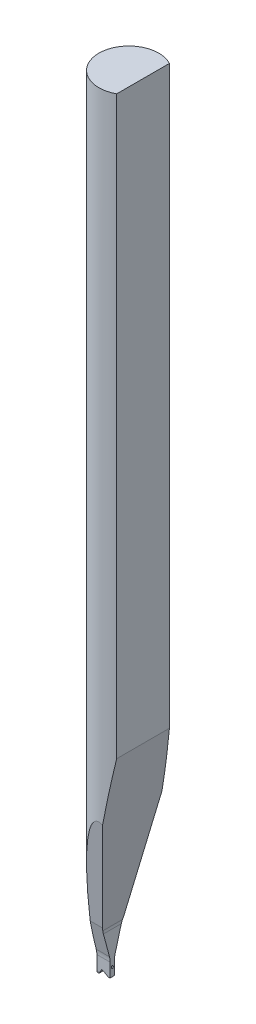
ISO-10303-21;
HEADER;
FILE_DESCRIPTION(('STEP AP214'),'2;1');
FILE_NAME('part.step','',(''),(''),'','','');
FILE_SCHEMA(('AUTOMOTIVE_DESIGN { 1 0 10303 214 1 1 1 1 }'));
ENDSEC;
DATA;
#1=APPLICATION_CONTEXT('core data for automotive mechanical design processes');
#2=APPLICATION_PROTOCOL_DEFINITION('international standard','automotive_design',2000,#1);
#3=PRODUCT_CONTEXT('',#1,'mechanical');
#4=PRODUCT('Part','Part','',(#3));
#5=PRODUCT_RELATED_PRODUCT_CATEGORY('part','',(#4));
#6=PRODUCT_DEFINITION_FORMATION('','',#4);
#7=PRODUCT_DEFINITION_CONTEXT('part definition',#1,'design');
#8=PRODUCT_DEFINITION('design','',#6,#7);
#9=PRODUCT_DEFINITION_SHAPE('','',#8);
#10=(LENGTH_UNIT() NAMED_UNIT(*) SI_UNIT(.MILLI.,.METRE.));
#11=(NAMED_UNIT(*) PLANE_ANGLE_UNIT() SI_UNIT($,.RADIAN.));
#12=(NAMED_UNIT(*) SI_UNIT($,.STERADIAN.) SOLID_ANGLE_UNIT());
#13=UNCERTAINTY_MEASURE_WITH_UNIT(LENGTH_MEASURE(1.E-05),#10,'distance_accuracy_value','');
#14=(GEOMETRIC_REPRESENTATION_CONTEXT(3) GLOBAL_UNCERTAINTY_ASSIGNED_CONTEXT((#13)) GLOBAL_UNIT_ASSIGNED_CONTEXT((#10,
#11,#12)) REPRESENTATION_CONTEXT('',''));
#15=CARTESIAN_POINT('',(0.,0.,0.));
#16=DIRECTION('',(0.,0.,1.));
#17=DIRECTION('',(1.,0.,0.));
#18=AXIS2_PLACEMENT_3D('',#15,#16,#17);
#19=CARTESIAN_POINT('',(26.8738719491216,0.,-0.0508));
#20=DIRECTION('',(0.,0.173648177666927,0.984807753012208));
#21=DIRECTION('',(0.,-0.984807753012209,0.173648177666927));
#22=AXIS2_PLACEMENT_3D('',#19,#20,#21);
#23=PLANE('',#22);
#24=DIRECTION('',(-0.49427041040807,-0.856101463504696,0.150953786239878));
#25=VECTOR('',#24,1.);
#26=CARTESIAN_POINT('',(6.01064718635582,11.6821755289432,-2.11068273912483));
#27=LINE('',#26,#25);
#28=CARTESIAN_POINT('',(-0.713268092858967,0.0360126395545259,-0.05715));
#29=VERTEX_POINT('',#28);
#30=CARTESIAN_POINT('',(-0.726727651581291,0.0126999999999957,-0.0530393526549967));
#31=VERTEX_POINT('',#30);
#32=EDGE_CURVE('E224',#29,#31,#27,.T.);
#33=ORIENTED_EDGE('',*,*,#32,.T.);
#34=CARTESIAN_POINT('',(-0.748724696837416,0.0254,-0.0552787053099949));
#35=DIRECTION('',(0.,0.173648177666927,0.984807753012208));
#36=DIRECTION('',(0.,-0.984807753012209,0.173648177666927));
#37=AXIS2_PLACEMENT_3D('',#34,#35,#36);
#38=ELLIPSE('',#37,0.0257918359418979,0.0254);
#39=CARTESIAN_POINT('',(-0.748724696837417,0.,-0.0508));
#40=VERTEX_POINT('',#39);
#41=EDGE_CURVE('E11',#31,#40,#38,.F.);
#42=ORIENTED_EDGE('',*,*,#41,.T.);
#43=DIRECTION('',(-1.,0.,0.));
#44=VECTOR('',#43,1.);
#45=CARTESIAN_POINT('',(26.8738719491216,0.,-0.0508));
#46=LINE('',#45,#44);
#47=CARTESIAN_POINT('',(-0.765396032391074,0.,-0.0508));
#48=VERTEX_POINT('',#47);
#49=EDGE_CURVE('E344',#40,#48,#46,.T.);
#50=ORIENTED_EDGE('',*,*,#49,.T.);
#51=CARTESIAN_POINT('',(-0.765396032391075,0.,-0.0508));
#52=CARTESIAN_POINT('',(-0.7668025377068,-1.30019635606427E-06,-0.0507997707403022));
#53=CARTESIAN_POINT('',(-0.768208814811664,0.000116241672625575,-0.0508204965431666));
#54=CARTESIAN_POINT('',(-0.77098052216773,0.000580888097255224,-0.0509024262443185));
#55=CARTESIAN_POINT('',(-0.772345985848006,0.000927799080594057,-0.0509635960105852));
#56=CARTESIAN_POINT('',(-0.774998983670717,0.00184336465673452,-0.0511250349242667));
#57=CARTESIAN_POINT('',(-0.776286470023878,0.00241215367265115,-0.0512253277741034));
#58=CARTESIAN_POINT('',(-0.778745824323787,0.00375450118883967,-0.0514620198586944));
#59=CARTESIAN_POINT('',(-0.779917714163149,0.00452802081294835,-0.0515984122385323));
#60=CARTESIAN_POINT('',(-0.782112782117624,0.00625682142307593,-0.051903246430363));
#61=CARTESIAN_POINT('',(-0.783136045101886,0.00721199795369106,-0.05207166982405));
#62=CARTESIAN_POINT('',(-0.785007120161919,0.00927677079875556,-0.052435744985669));
#63=CARTESIAN_POINT('',(-0.785854900675146,0.0103863948324469,-0.0526314016412513));
#64=CARTESIAN_POINT('',(-0.787359679409057,0.0127389562129212,-0.0530462216864017));
#65=CARTESIAN_POINT('',(-0.788014840256034,0.0139830318198768,-0.0532655857819492));
#66=CARTESIAN_POINT('',(-0.789107287961981,0.0165606350118712,-0.0537200867702581));
#67=CARTESIAN_POINT('',(-0.789544625225715,0.0178941418212571,-0.0539552199997113));
#68=CARTESIAN_POINT('',(-0.790107517305666,0.0202600033775736,-0.0543723852247108));
#69=CARTESIAN_POINT('',(-0.790284504455732,0.0212808224908233,-0.0545523831767996));
#70=CARTESIAN_POINT('',(-0.790511976215286,0.0233345874044375,-0.0549145173431022));
#71=CARTESIAN_POINT('',(-0.790562639039543,0.0243675140530945,-0.0550966501803532));
#72=CARTESIAN_POINT('',(-0.790549691758687,0.0253999999999247,-0.0552787053099816));
#73=B_SPLINE_CURVE_WITH_KNOTS('',3,(#51,#52,#53,#54,#55,#56,#57,#58,#59,#60,#61,#62,#63,#64,#65,
#66,#67,#68,#69,#70,#71,#72),.UNSPECIFIED.,.F.,.F.,(4,2,2,2,2,2,2,2,2,2,4),(0.,
0.00421411879651477,0.00842468568820049,0.0126378074915218,0.0168501298411226,
0.0210600373267433,0.0252707013560046,0.0295203160522539,0.0337689469227172,0.0369162992035178,
0.0400592087705206),.UNSPECIFIED.);
#74=CARTESIAN_POINT('',(-0.790549691758368,0.0254000000000009,-0.0552787053099945));
#75=VERTEX_POINT('',#74);
#76=EDGE_CURVE('E489',#48,#75,#73,.T.);
#77=ORIENTED_EDGE('',*,*,#76,.T.);
#78=CARTESIAN_POINT('',(0.,-0.288101116436582,0.));
#79=DIRECTION('',(0.,0.173648177666927,0.984807753012208));
#80=DIRECTION('',(0.,-0.984807753012209,0.173648177666927));
#81=AXIS2_PLACEMENT_3D('',#78,#79,#80);
#82=ELLIPSE('',#81,4.56371043248175,0.79248);
#83=CARTESIAN_POINT('',(-0.790416616664898,0.0360126395545731,-0.05715));
#84=VERTEX_POINT('',#83);
#85=EDGE_CURVE('E357',#84,#75,#82,.T.);
#86=ORIENTED_EDGE('',*,*,#85,.F.);
#87=DIRECTION('',(1.,0.,0.));
#88=VECTOR('',#87,1.);
#89=CARTESIAN_POINT('',(26.8738719491216,0.0360126395545731,-0.05715));
#90=LINE('',#89,#88);
#91=EDGE_CURVE('E507',#84,#29,#90,.T.);
#92=ORIENTED_EDGE('',*,*,#91,.T.);
#93=EDGE_LOOP('',(#33,#42,#50,#77,#86,#92));
#94=FACE_BOUND('',#93,.T.);
#95=ADVANCED_FACE('F43',(#94),#23,.F.);
#96=CARTESIAN_POINT('',(26.8738719491216,0.,0.0508));
#97=DIRECTION('',(0.,0.173648177666927,-0.984807753012208));
#98=DIRECTION('',(0.,0.984807753012209,0.173648177666927));
#99=AXIS2_PLACEMENT_3D('',#96,#97,#98);
#100=PLANE('',#99);
#101=CARTESIAN_POINT('',(0.,-0.288101116436582,0.));
#102=DIRECTION('',(0.,0.173648177666927,-0.984807753012208));
#103=DIRECTION('',(0.,-0.984807753012209,-0.173648177666927));
#104=AXIS2_PLACEMENT_3D('',#101,#102,#103);
#105=ELLIPSE('',#104,4.56371043248175,0.79248);
#106=CARTESIAN_POINT('',(-0.740366263471622,1.31479964505741,0.282634651649531));
#107=VERTEX_POINT('',#106);
#108=CARTESIAN_POINT('',(0.090264175576461,4.1770274203353,0.787322633364177));
#109=VERTEX_POINT('',#108);
#110=EDGE_CURVE('E356',#107,#109,#105,.T.);
#111=ORIENTED_EDGE('',*,*,#110,.F.);
#112=DIRECTION('',(1.,0.,0.));
#113=VECTOR('',#112,1.);
#114=CARTESIAN_POINT('',(26.8738719491216,1.31479964505741,0.282634651649531));
#115=LINE('',#114,#113);
#116=CARTESIAN_POINT('',(-0.414423806138194,1.31479964505743,0.282634651649535));
#117=VERTEX_POINT('',#116);
#118=EDGE_CURVE('E315',#107,#117,#115,.T.);
#119=ORIENTED_EDGE('',*,*,#118,.T.);
#120=DIRECTION('',(0.171087869746036,0.970287525247814,0.171087869746032));
#121=VECTOR('',#120,1.);
#122=CARTESIAN_POINT('',(0.159284907835618,4.56846344437336,0.856343365623333));
#123=LINE('',#122,#121);
#124=EDGE_CURVE('E378',#117,#109,#123,.T.);
#125=ORIENTED_EDGE('',*,*,#124,.T.);
#126=EDGE_LOOP('',(#111,#119,#125));
#127=FACE_BOUND('',#126,.T.);
#128=ADVANCED_FACE('F439',(#127),#100,.F.);
#129=CARTESIAN_POINT('',(0.,0.,0.));
#130=DIRECTION('',(0.,1.,0.));
#131=DIRECTION('',(0.,0.,1.));
#132=AXIS2_PLACEMENT_3D('',#129,#130,#131);
#133=PLANE('',#132);
#134=ORIENTED_EDGE('',*,*,#49,.F.);
#135=DIRECTION('',(0.,0.,1.));
#136=VECTOR('',#135,1.);
#137=CARTESIAN_POINT('',(-0.748724696837416,0.,0.));
#138=LINE('',#137,#136);
#139=CARTESIAN_POINT('',(-0.748724696837417,0.,0.0508));
#140=VERTEX_POINT('',#139);
#141=EDGE_CURVE('E746',#40,#140,#138,.T.);
#142=ORIENTED_EDGE('',*,*,#141,.T.);
#143=DIRECTION('',(-1.,0.,0.));
#144=VECTOR('',#143,1.);
#145=CARTESIAN_POINT('',(26.8738719491216,0.,0.0508));
#146=LINE('',#145,#144);
#147=CARTESIAN_POINT('',(-0.765396032391074,0.,0.0508));
#148=VERTEX_POINT('',#147);
#149=EDGE_CURVE('E348',#140,#148,#146,.T.);
#150=ORIENTED_EDGE('',*,*,#149,.T.);
#151=CARTESIAN_POINT('',(0.,0.,0.));
#152=DIRECTION('',(0.,1.,0.));
#153=DIRECTION('',(0.,0.,1.));
#154=AXIS2_PLACEMENT_3D('',#151,#152,#153);
#155=CIRCLE('',#154,0.76708);
#156=EDGE_CURVE('E428',#148,#48,#155,.F.);
#157=ORIENTED_EDGE('',*,*,#156,.T.);
#158=EDGE_LOOP('',(#134,#142,#150,#157));
#159=FACE_BOUND('',#158,.T.);
#160=ADVANCED_FACE('F447',(#159),#133,.F.);
#161=CARTESIAN_POINT('',(0.,21.0312,0.));
#162=DIRECTION('',(0.,-1.,0.));
#163=DIRECTION('',(0.,0.,-1.));
#164=AXIS2_PLACEMENT_3D('',#161,#162,#163);
#165=CYLINDRICAL_SURFACE('',#164,0.79248);
#166=ORIENTED_EDGE('',*,*,#85,.T.);
#167=CARTESIAN_POINT('',(0.,0.0253999999999983,0.));
#168=DIRECTION('',(0.,1.,0.));
#169=DIRECTION('',(0.,0.,1.));
#170=AXIS2_PLACEMENT_3D('',#167,#168,#169);
#171=CIRCLE('',#170,0.79248);
#172=CARTESIAN_POINT('',(-0.790549691758368,0.0253999999999988,0.0552787053099941));
#173=VERTEX_POINT('',#172);
#174=EDGE_CURVE('E415',#75,#173,#171,.T.);
#175=ORIENTED_EDGE('',*,*,#174,.T.);
#176=CARTESIAN_POINT('',(-0.790416616664898,0.0360126395545731,0.05715));
#177=VERTEX_POINT('',#176);
#178=EDGE_CURVE('E358',#173,#177,#105,.T.);
#179=ORIENTED_EDGE('',*,*,#178,.T.);
#180=DIRECTION('',(0.,-1.,0.));
#181=VECTOR('',#180,1.);
#182=CARTESIAN_POINT('',(-0.790416616664908,21.0312,0.0571499999999972));
#183=LINE('',#182,#181);
#184=CARTESIAN_POINT('',(-0.790416616664902,0.4064,0.05715));
#185=VERTEX_POINT('',#184);
#186=EDGE_CURVE('E306',#177,#185,#183,.F.);
#187=ORIENTED_EDGE('',*,*,#186,.T.);
#188=CARTESIAN_POINT('',(-0.790416616664908,0.4064,0.05715));
#189=CARTESIAN_POINT('',(-0.790439489960335,0.428694366525716,0.0571627673584451));
#190=CARTESIAN_POINT('',(-0.790330726145837,0.450798224070478,0.0586116247584144));
#191=CARTESIAN_POINT('',(-0.789849924358285,0.494624915610687,0.0643815189058058));
#192=CARTESIAN_POINT('',(-0.789477886452361,0.516347749703286,0.0687025549208876));
#193=CARTESIAN_POINT('',(-0.788974211503639,0.537880074912081,0.0744596802451533));
#194=B_SPLINE_CURVE_WITH_KNOTS('',3,(#188,#189,#190,#191,#192,#193),.UNSPECIFIED.,.F.,.F.,(4,2,
4),(0.,0.0664546749388415,0.132909332933258),.UNSPECIFIED.);
#195=CARTESIAN_POINT('',(-0.788974211503639,0.537880074912081,0.0744596802451533));
#196=VERTEX_POINT('',#195);
#197=EDGE_CURVE('E296',#185,#196,#194,.T.);
#198=ORIENTED_EDGE('',*,*,#197,.T.);
#199=CARTESIAN_POINT('',(0.,0.259992765121835,0.));
#200=DIRECTION('',(0.,0.258819045102521,-0.965925826289068));
#201=DIRECTION('',(0.,-0.965925826289068,-0.258819045102521));
#202=AXIS2_PLACEMENT_3D('',#199,#200,#201);
#203=ELLIPSE('',#202,3.06190759527023,0.79248);
#204=EDGE_CURVE('E319',#196,#107,#203,.T.);
#205=ORIENTED_EDGE('',*,*,#204,.T.);
#206=ORIENTED_EDGE('',*,*,#110,.T.);
#207=CARTESIAN_POINT('',(0.,3.66511384242575,0.));
#208=DIRECTION('',(-0.984807753012208,0.173648177666931,0.));
#209=DIRECTION('',(-0.173648177666931,-0.984807753012208,0.));
#210=AXIS2_PLACEMENT_3D('',#207,#208,#209);
#211=ELLIPSE('',#210,4.56371043248166,0.79248);
#212=CARTESIAN_POINT('',(0.37592,5.79706210405643,0.697645113220187));
#213=VERTEX_POINT('',#212);
#214=EDGE_CURVE('E332',#109,#213,#211,.T.);
#215=ORIENTED_EDGE('',*,*,#214,.T.);
#216=DIRECTION('',(0.,-1.,0.));
#217=VECTOR('',#216,1.);
#218=CARTESIAN_POINT('',(0.37592,21.0312,0.697645113220182));
#219=LINE('',#218,#217);
#220=CARTESIAN_POINT('',(0.37592,21.0312,0.697645113220182));
#221=VERTEX_POINT('',#220);
#222=EDGE_CURVE('E351',#221,#213,#219,.T.);
#223=ORIENTED_EDGE('',*,*,#222,.F.);
#224=CARTESIAN_POINT('',(0.,21.0312,0.));
#225=DIRECTION('',(0.,1.,0.));
#226=DIRECTION('',(0.,0.,1.));
#227=AXIS2_PLACEMENT_3D('',#224,#225,#226);
#228=CIRCLE('',#227,0.79248);
#229=CARTESIAN_POINT('',(0.37592,21.0312,-0.697645113220182));
#230=VERTEX_POINT('',#229);
#231=EDGE_CURVE('E361',#230,#221,#228,.T.);
#232=ORIENTED_EDGE('',*,*,#231,.F.);
#233=DIRECTION('',(0.,-1.,0.));
#234=VECTOR('',#233,1.);
#235=CARTESIAN_POINT('',(0.37592,21.0312,-0.697645113220182));
#236=LINE('',#235,#234);
#237=CARTESIAN_POINT('',(0.37592,5.79706210405643,-0.697645113220173));
#238=VERTEX_POINT('',#237);
#239=EDGE_CURVE('E368',#230,#238,#236,.T.);
#240=ORIENTED_EDGE('',*,*,#239,.T.);
#241=CARTESIAN_POINT('',(0.090264175576461,4.1770274203353,-0.787322633364177));
#242=VERTEX_POINT('',#241);
#243=EDGE_CURVE('E340',#238,#242,#211,.T.);
#244=ORIENTED_EDGE('',*,*,#243,.T.);
#245=CARTESIAN_POINT('',(-0.740366263471622,1.31479964505741,-0.282634651649531));
#246=VERTEX_POINT('',#245);
#247=EDGE_CURVE('E352',#242,#246,#82,.T.);
#248=ORIENTED_EDGE('',*,*,#247,.T.);
#249=CARTESIAN_POINT('',(0.,0.259992765121835,0.));
#250=DIRECTION('',(0.,0.258819045102521,0.965925826289068));
#251=DIRECTION('',(0.,-0.965925826289068,0.258819045102521));
#252=AXIS2_PLACEMENT_3D('',#249,#250,#251);
#253=ELLIPSE('',#252,3.06190759527023,0.79248);
#254=CARTESIAN_POINT('',(-0.788974211503625,0.537880074912081,-0.0744596802451533));
#255=VERTEX_POINT('',#254);
#256=EDGE_CURVE('E255',#246,#255,#253,.T.);
#257=ORIENTED_EDGE('',*,*,#256,.T.);
#258=CARTESIAN_POINT('',(-0.788974211503639,0.537880074912081,-0.0744596802451533));
#259=CARTESIAN_POINT('',(-0.789477886452361,0.516347749703286,-0.0687025549208876));
#260=CARTESIAN_POINT('',(-0.789849924358285,0.494624915610687,-0.0643815189058058));
#261=CARTESIAN_POINT('',(-0.790330726145837,0.450798224070478,-0.0586116247584144));
#262=CARTESIAN_POINT('',(-0.790439489960336,0.428694366525716,-0.057162767358445));
#263=CARTESIAN_POINT('',(-0.790416616664908,0.4064,-0.0571499999999999));
#264=B_SPLINE_CURVE_WITH_KNOTS('',3,(#258,#259,#260,#261,#262,#263),.UNSPECIFIED.,.F.,.F.,(4,2,
4),(0.,0.0664546579944162,0.132909332933258),.UNSPECIFIED.);
#265=CARTESIAN_POINT('',(-0.790416616664908,0.4064,-0.05715));
#266=VERTEX_POINT('',#265);
#267=EDGE_CURVE('E259',#255,#266,#264,.T.);
#268=ORIENTED_EDGE('',*,*,#267,.T.);
#269=DIRECTION('',(0.,-1.,0.));
#270=VECTOR('',#269,1.);
#271=CARTESIAN_POINT('',(-0.790416616664908,21.0312,-0.0571499999999972));
#272=LINE('',#271,#270);
#273=EDGE_CURVE('E484',#266,#84,#272,.T.);
#274=ORIENTED_EDGE('',*,*,#273,.T.);
#275=EDGE_LOOP('',(#166,#175,#179,#187,#198,#205,#206,#215,#223,#232,#240,#244,#248,#257,#268,#274));
#276=FACE_BOUND('',#275,.T.);
#277=ADVANCED_FACE('F270',(#276),#165,.T.);
#278=CARTESIAN_POINT('',(0.37592,21.0312,0.697645113220182));
#279=DIRECTION('',(-1.,0.,0.));
#280=DIRECTION('',(0.,0.,1.));
#281=AXIS2_PLACEMENT_3D('',#278,#279,#280);
#282=PLANE('',#281);
#283=ORIENTED_EDGE('',*,*,#222,.T.);
#284=DIRECTION('',(0.,0.,-1.));
#285=VECTOR('',#284,1.);
#286=CARTESIAN_POINT('',(0.37592,5.79706210405643,26.4674719491216));
#287=LINE('',#286,#285);
#288=EDGE_CURVE('E328',#213,#238,#287,.T.);
#289=ORIENTED_EDGE('',*,*,#288,.T.);
#290=ORIENTED_EDGE('',*,*,#239,.F.);
#291=DIRECTION('',(0.,0.,-1.));
#292=VECTOR('',#291,1.);
#293=CARTESIAN_POINT('',(0.37592,21.0312,0.697645113220182));
#294=LINE('',#293,#292);
#295=EDGE_CURVE('E365',#221,#230,#294,.T.);
#296=ORIENTED_EDGE('',*,*,#295,.F.);
#297=EDGE_LOOP('',(#283,#289,#290,#296));
#298=FACE_BOUND('',#297,.T.);
#299=ADVANCED_FACE('F445',(#298),#282,.F.);
#300=CARTESIAN_POINT('',(0.,21.0312,0.));
#301=DIRECTION('',(0.,1.,0.));
#302=DIRECTION('',(0.,0.,1.));
#303=AXIS2_PLACEMENT_3D('',#300,#301,#302);
#304=PLANE('',#303);
#305=ORIENTED_EDGE('',*,*,#231,.T.);
#306=ORIENTED_EDGE('',*,*,#295,.T.);
#307=EDGE_LOOP('',(#305,#306));
#308=FACE_BOUND('',#307,.T.);
#309=ADVANCED_FACE('F442',(#308),#304,.T.);
#310=DIRECTION('',(-0.171087869746036,-0.970287525247814,0.171087869746032));
#311=VECTOR('',#310,1.);
#312=CARTESIAN_POINT('',(0.159284907835618,4.56846344437336,-0.856343365623333));
#313=LINE('',#312,#311);
#314=CARTESIAN_POINT('',(-0.414423806138194,1.31479964505743,-0.282634651649537));
#315=VERTEX_POINT('',#314);
#316=EDGE_CURVE('E339',#242,#315,#313,.T.);
#317=ORIENTED_EDGE('',*,*,#316,.T.);
#318=DIRECTION('',(-1.,0.,0.));
#319=VECTOR('',#318,1.);
#320=CARTESIAN_POINT('',(26.8738719491216,1.31479964505741,-0.282634651649531));
#321=LINE('',#320,#319);
#322=EDGE_CURVE('E251',#315,#246,#321,.T.);
#323=ORIENTED_EDGE('',*,*,#322,.T.);
#324=ORIENTED_EDGE('',*,*,#247,.F.);
#325=EDGE_LOOP('',(#317,#323,#324));
#326=FACE_BOUND('',#325,.T.);
#327=ADVANCED_FACE('F438',(#326),#23,.F.);
#328=ORIENTED_EDGE('',*,*,#149,.F.);
#329=CARTESIAN_POINT('',(-0.748724696837416,0.0254,0.0552787053099949));
#330=DIRECTION('',(0.,0.173648177666927,-0.984807753012208));
#331=DIRECTION('',(0.,0.984807753012209,0.173648177666927));
#332=AXIS2_PLACEMENT_3D('',#329,#330,#331);
#333=ELLIPSE('',#332,0.0257918359418979,0.0254);
#334=CARTESIAN_POINT('',(-0.726727651581291,0.0126999999999957,0.0530393526549967));
#335=VERTEX_POINT('',#334);
#336=EDGE_CURVE('E66',#140,#335,#333,.F.);
#337=ORIENTED_EDGE('',*,*,#336,.T.);
#338=DIRECTION('',(0.49427041040807,0.856101463504696,0.150953786239878));
#339=VECTOR('',#338,1.);
#340=CARTESIAN_POINT('',(6.01064718635582,11.6821755289432,2.11068273912483));
#341=LINE('',#340,#339);
#342=CARTESIAN_POINT('',(-0.713268092858967,0.0360126395545259,0.05715));
#343=VERTEX_POINT('',#342);
#344=EDGE_CURVE('E197',#335,#343,#341,.T.);
#345=ORIENTED_EDGE('',*,*,#344,.T.);
#346=DIRECTION('',(-1.,0.,0.));
#347=VECTOR('',#346,1.);
#348=CARTESIAN_POINT('',(26.8738719491216,0.0360126395545731,0.05715));
#349=LINE('',#348,#347);
#350=EDGE_CURVE('E493',#343,#177,#349,.T.);
#351=ORIENTED_EDGE('',*,*,#350,.T.);
#352=ORIENTED_EDGE('',*,*,#178,.F.);
#353=CARTESIAN_POINT('',(-0.790549691758368,0.0253999999999983,0.055278705309994));
#354=CARTESIAN_POINT('',(-0.790568499744369,0.0239705829901058,0.0550266605244668));
#355=CARTESIAN_POINT('',(-0.790463934378654,0.0225397039526685,0.0547743579440366));
#356=CARTESIAN_POINT('',(-0.790014515516168,0.0197151707661977,0.0542763165353554));
#357=CARTESIAN_POINT('',(-0.78966968634322,0.0183215128638002,0.0540305770452852));
#358=CARTESIAN_POINT('',(-0.788745805013242,0.0156101071691054,0.0535524830656639));
#359=CARTESIAN_POINT('',(-0.788166552931448,0.0142924252706662,0.0533201401949779));
#360=CARTESIAN_POINT('',(-0.7867891970827,0.0117736573119871,0.0528760134457188));
#361=CARTESIAN_POINT('',(-0.78599118087936,0.0105725248609823,0.0526642213872022));
#362=CARTESIAN_POINT('',(-0.784208612267366,0.00833615762232048,0.0522698895042536));
#363=CARTESIAN_POINT('',(-0.783226404552837,0.00729911079630225,0.0520870301685685));
#364=CARTESIAN_POINT('',(-0.781096551365659,0.00540493600327271,0.0517530360463795));
#365=CARTESIAN_POINT('',(-0.779948884758434,0.00454783105520113,0.0516019053187358));
#366=CARTESIAN_POINT('',(-0.777539225875822,0.0030509082967586,0.0513379574483858));
#367=CARTESIAN_POINT('',(-0.776279136893455,0.00240811445941874,0.0512246155518297));
#368=CARTESIAN_POINT('',(-0.773666931678152,0.0013419883510002,0.0510366287540778));
#369=CARTESIAN_POINT('',(-0.772314869535047,0.000918528329725311,0.0509619613270757));
#370=CARTESIAN_POINT('',(-0.770028113456195,0.000407527489767996,0.0508718580918265));
#371=CARTESIAN_POINT('',(-0.769107899358952,0.000254717858666491,0.0508449136309512));
#372=CARTESIAN_POINT('',(-0.76725725321673,5.09573214590332E-05,0.0508089851506379));
#373=CARTESIAN_POINT('',(-0.766326837752019,-1.3961535734153E-07,0.0507999753820456));
#374=CARTESIAN_POINT('',(-0.765396032391098,0.,0.050799999999983));
#375=B_SPLINE_CURVE_WITH_KNOTS('',3,(#353,#354,#355,#356,#357,#358,#359,#360,#361,#362,#363,
#364,#365,#366,#367,#368,#369,#370,#371,#372,#373,#374),.UNSPECIFIED.,.F.,.F.,(4,2,2,2,2,2,2,2,
2,2,4),(0.,0.00434964153441994,0.00869884278388604,0.0130517610402942,0.0174029395135876,
0.0217020869577994,0.0260017840327996,0.0302390110323467,0.0344737672910665,0.0372679758913299,
0.0400581698951772),.UNSPECIFIED.);
#376=EDGE_CURVE('E419',#173,#148,#375,.T.);
#377=ORIENTED_EDGE('',*,*,#376,.T.);
#378=EDGE_LOOP('',(#328,#337,#345,#351,#352,#377));
#379=FACE_BOUND('',#378,.T.);
#380=ADVANCED_FACE('F432',(#379),#100,.F.);
#381=CARTESIAN_POINT('',(-0.69088,0.,26.4674719491216));
#382=DIRECTION('',(-0.173648177666931,0.984807753012208,0.));
#383=DIRECTION('',(-0.984807753012208,-0.173648177666931,0.));
#384=AXIS2_PLACEMENT_3D('',#381,#382,#383);
#385=PLANE('',#384);
#386=DIRECTION('',(-0.984807753012208,-0.173648177666931,0.));
#387=VECTOR('',#386,1.);
#388=CARTESIAN_POINT('',(-0.690880000000001,0.,0.0571499999999989));
#389=LINE('',#388,#387);
#390=CARTESIAN_POINT('',(-0.43688,0.0447870530999504,0.0571499999999989));
#391=VERTEX_POINT('',#390);
#392=CARTESIAN_POINT('',(-0.482834169941549,0.0366840930631976,0.0571499999999994));
#393=VERTEX_POINT('',#392);
#394=EDGE_CURVE('E500',#391,#393,#389,.T.);
#395=ORIENTED_EDGE('',*,*,#394,.T.);
#396=DIRECTION('',(0.,0.,-1.));
#397=VECTOR('',#396,1.);
#398=CARTESIAN_POINT('',(-0.482834169941541,0.0366840930631946,26.4674719491216));
#399=LINE('',#398,#397);
#400=CARTESIAN_POINT('',(-0.482834169941541,0.0366840930631946,-0.0571499999999989));
#401=VERTEX_POINT('',#400);
#402=EDGE_CURVE('E213',#393,#401,#399,.T.);
#403=ORIENTED_EDGE('',*,*,#402,.T.);
#404=DIRECTION('',(0.984807753012208,0.173648177666931,0.));
#405=VECTOR('',#404,1.);
#406=CARTESIAN_POINT('',(-0.690879999999999,0.,-0.0571499999999989));
#407=LINE('',#406,#405);
#408=CARTESIAN_POINT('',(-0.43688,0.0447870530999506,-0.0571499999999989));
#409=VERTEX_POINT('',#408);
#410=EDGE_CURVE('E211',#401,#409,#407,.T.);
#411=ORIENTED_EDGE('',*,*,#410,.T.);
#412=DIRECTION('',(0.,0.,1.));
#413=VECTOR('',#412,1.);
#414=CARTESIAN_POINT('',(-0.43688,0.0447870530999504,26.4674719491216));
#415=LINE('',#414,#413);
#416=EDGE_CURVE('E347',#409,#391,#415,.T.);
#417=ORIENTED_EDGE('',*,*,#416,.T.);
#418=EDGE_LOOP('',(#395,#403,#411,#417));
#419=FACE_BOUND('',#418,.T.);
#420=ADVANCED_FACE('F437',(#419),#385,.F.);
#421=CARTESIAN_POINT('',(-0.429162338530202,1.2312132742548,26.4674719491216));
#422=DIRECTION('',(-0.984807753012208,0.173648177666931,0.));
#423=DIRECTION('',(-0.173648177666931,-0.984807753012208,0.));
#424=AXIS2_PLACEMENT_3D('',#421,#422,#423);
#425=PLANE('',#424);
#426=ORIENTED_EDGE('',*,*,#124,.F.);
#427=DIRECTION('',(-0.167900917937429,-0.952213423395662,-0.255144817820943));
#428=VECTOR('',#427,1.);
#429=CARTESIAN_POINT('',(0.693530654555205,7.59832163495225,1.96629929446506));
#430=LINE('',#429,#428);
#431=CARTESIAN_POINT('',(-0.429162338530202,1.2312132742548,0.260237751094725));
#432=VERTEX_POINT('',#431);
#433=EDGE_CURVE('E311',#117,#432,#430,.T.);
#434=ORIENTED_EDGE('',*,*,#433,.T.);
#435=DIRECTION('',(0.,0.,-1.));
#436=VECTOR('',#435,1.);
#437=CARTESIAN_POINT('',(-0.429162338530202,1.2312132742548,26.4674719491216));
#438=LINE('',#437,#436);
#439=CARTESIAN_POINT('',(-0.429162338530202,1.2312132742548,-0.260237751094728));
#440=VERTEX_POINT('',#439);
#441=EDGE_CURVE('E327',#432,#440,#438,.T.);
#442=ORIENTED_EDGE('',*,*,#441,.T.);
#443=DIRECTION('',(0.167900917937429,0.952213423395662,-0.255144817820943));
#444=VECTOR('',#443,1.);
#445=CARTESIAN_POINT('',(-1.5741520072192,-5.2623458174312,1.47970616352631));
#446=LINE('',#445,#444);
#447=EDGE_CURVE('E247',#440,#315,#446,.T.);
#448=ORIENTED_EDGE('',*,*,#447,.T.);
#449=ORIENTED_EDGE('',*,*,#316,.F.);
#450=ORIENTED_EDGE('',*,*,#243,.F.);
#451=ORIENTED_EDGE('',*,*,#288,.F.);
#452=ORIENTED_EDGE('',*,*,#214,.F.);
#453=EDGE_LOOP('',(#426,#434,#442,#448,#449,#450,#451,#452));
#454=FACE_BOUND('',#453,.T.);
#455=ADVANCED_FACE('F470',(#454),#425,.F.);
#456=CARTESIAN_POINT('',(0.0711200000000001,1.143,26.4674719491216));
#457=DIRECTION('',(0.,0.,-1.));
#458=DIRECTION('',(-1.,0.,0.));
#459=AXIS2_PLACEMENT_3D('',#456,#457,#458);
#460=CYLINDRICAL_SURFACE('',#459,0.508);
#461=ORIENTED_EDGE('',*,*,#441,.F.);
#462=CARTESIAN_POINT('',(0.0711200000000001,1.143,0.236601075496445));
#463=DIRECTION('',(0.,0.258819045102521,-0.965925826289068));
#464=DIRECTION('',(0.,-0.965925826289068,-0.258819045102521));
#465=AXIS2_PLACEMENT_3D('',#462,#463,#464);
#466=ELLIPSE('',#465,0.525920299648322,0.508);
#467=CARTESIAN_POINT('',(-0.43688,1.143,0.236601075496444));
#468=VERTEX_POINT('',#467);
#469=EDGE_CURVE('E305',#432,#468,#466,.F.);
#470=ORIENTED_EDGE('',*,*,#469,.T.);
#471=DIRECTION('',(0.,0.,-1.));
#472=VECTOR('',#471,1.);
#473=CARTESIAN_POINT('',(-0.43688,1.143,26.4674719491216));
#474=LINE('',#473,#472);
#475=CARTESIAN_POINT('',(-0.43688,1.143,-0.236601075496445));
#476=VERTEX_POINT('',#475);
#477=EDGE_CURVE('E323',#468,#476,#474,.T.);
#478=ORIENTED_EDGE('',*,*,#477,.T.);
#479=CARTESIAN_POINT('',(0.0711200000000001,1.143,-0.236601075496445));
#480=DIRECTION('',(0.,0.258819045102521,0.965925826289068));
#481=DIRECTION('',(0.,0.965925826289068,-0.258819045102521));
#482=AXIS2_PLACEMENT_3D('',#479,#480,#481);
#483=ELLIPSE('',#482,0.525920299648322,0.508);
#484=EDGE_CURVE('E243',#476,#440,#483,.F.);
#485=ORIENTED_EDGE('',*,*,#484,.T.);
#486=EDGE_LOOP('',(#461,#470,#478,#485));
#487=FACE_BOUND('',#486,.T.);
#488=ADVANCED_FACE('F523',(#487),#460,.F.);
#489=CARTESIAN_POINT('',(-0.43688,0.,26.4674719491216));
#490=DIRECTION('',(-1.,0.,0.));
#491=DIRECTION('',(0.,0.,1.));
#492=AXIS2_PLACEMENT_3D('',#489,#490,#491);
#493=PLANE('',#492);
#494=CARTESIAN_POINT('',(-0.43688,0.266690884248374,0.));
#495=DIRECTION('',(-1.,0.,0.));
#496=DIRECTION('',(0.,-1.,0.));
#497=AXIS2_PLACEMENT_3D('',#494,#495,#496);
#498=ELLIPSE('',#497,0.0359210244842769,0.0254000000000001);
#499=CARTESIAN_POINT('',(-0.43688,0.230769859764097,0.));
#500=VERTEX_POINT('',#499);
#501=EDGE_CURVE('E206',#500,#500,#498,.T.);
#502=ORIENTED_EDGE('',*,*,#501,.T.);
#503=EDGE_LOOP('',(#502));
#504=FACE_BOUND('',#503,.T.);
#505=ORIENTED_EDGE('',*,*,#477,.F.);
#506=DIRECTION('',(0.,-0.965925826289068,-0.258819045102521));
#507=VECTOR('',#506,1.);
#508=CARTESIAN_POINT('',(-0.43688,6.6342842001435,1.70798624233468));
#509=LINE('',#508,#507);
#510=CARTESIAN_POINT('',(-0.436879999999994,0.537880074912081,0.0744596802451533));
#511=VERTEX_POINT('',#510);
#512=EDGE_CURVE('E402',#468,#511,#509,.T.);
#513=ORIENTED_EDGE('',*,*,#512,.T.);
#514=CARTESIAN_POINT('',(-0.436880000000001,0.4064,0.56515));
#515=DIRECTION('',(-1.,0.,0.));
#516=DIRECTION('',(0.,0.,1.));
#517=AXIS2_PLACEMENT_3D('',#514,#515,#516);
#518=CIRCLE('',#517,0.508);
#519=CARTESIAN_POINT('',(-0.436879999999994,0.4064,0.05715));
#520=VERTEX_POINT('',#519);
#521=EDGE_CURVE('E398',#511,#520,#518,.T.);
#522=ORIENTED_EDGE('',*,*,#521,.T.);
#523=DIRECTION('',(0.,-1.,0.));
#524=VECTOR('',#523,1.);
#525=CARTESIAN_POINT('',(-0.43688,0.,0.0571499999999989));
#526=LINE('',#525,#524);
#527=EDGE_CURVE('E394',#520,#391,#526,.T.);
#528=ORIENTED_EDGE('',*,*,#527,.T.);
#529=ORIENTED_EDGE('',*,*,#416,.F.);
#530=DIRECTION('',(0.,1.,0.));
#531=VECTOR('',#530,1.);
#532=CARTESIAN_POINT('',(-0.43688,0.,-0.0571499999999989));
#533=LINE('',#532,#531);
#534=CARTESIAN_POINT('',(-0.436879999999994,0.4064,-0.05715));
#535=VERTEX_POINT('',#534);
#536=EDGE_CURVE('E390',#409,#535,#533,.T.);
#537=ORIENTED_EDGE('',*,*,#536,.T.);
#538=CARTESIAN_POINT('',(-0.436880000000001,0.4064,-0.56515));
#539=DIRECTION('',(-1.,0.,0.));
#540=DIRECTION('',(0.,0.,1.));
#541=AXIS2_PLACEMENT_3D('',#538,#539,#540);
#542=CIRCLE('',#541,0.508);
#543=CARTESIAN_POINT('',(-0.436879999999994,0.537880074912081,-0.0744596802451533));
#544=VERTEX_POINT('',#543);
#545=EDGE_CURVE('E386',#535,#544,#542,.T.);
#546=ORIENTED_EDGE('',*,*,#545,.T.);
#547=DIRECTION('',(0.,0.965925826289068,-0.258819045102521));
#548=VECTOR('',#547,1.);
#549=CARTESIAN_POINT('',(-0.43688,-6.59945177441733,1.8379826248956));
#550=LINE('',#549,#548);
#551=EDGE_CURVE('E382',#544,#476,#550,.T.);
#552=ORIENTED_EDGE('',*,*,#551,.T.);
#553=EDGE_LOOP('',(#505,#513,#522,#528,#529,#537,#546,#552));
#554=FACE_BOUND('',#553,.T.);
#555=ADVANCED_FACE('F517',(#504,#554),#493,.F.);
#556=CARTESIAN_POINT('',(27.2675719491216,0.537880074912081,-0.0744596802451533));
#557=DIRECTION('',(0.,0.258819045102521,0.965925826289068));
#558=DIRECTION('',(0.,-0.965925826289068,0.258819045102521));
#559=AXIS2_PLACEMENT_3D('',#556,#557,#558);
#560=PLANE('',#559);
#561=ORIENTED_EDGE('',*,*,#256,.F.);
#562=ORIENTED_EDGE('',*,*,#322,.F.);
#563=ORIENTED_EDGE('',*,*,#447,.F.);
#564=ORIENTED_EDGE('',*,*,#484,.F.);
#565=ORIENTED_EDGE('',*,*,#551,.F.);
#566=DIRECTION('',(-1.,0.,0.));
#567=VECTOR('',#566,1.);
#568=CARTESIAN_POINT('',(27.2675719491216,0.537880074912081,-0.0744596802451533));
#569=LINE('',#568,#567);
#570=EDGE_CURVE('E227',#544,#255,#569,.T.);
#571=ORIENTED_EDGE('',*,*,#570,.T.);
#572=EDGE_LOOP('',(#561,#562,#563,#564,#565,#571));
#573=FACE_BOUND('',#572,.T.);
#574=ADVANCED_FACE('F278',(#573),#560,.F.);
#575=CARTESIAN_POINT('',(27.2675719491216,0.4064,-0.56515));
#576=DIRECTION('',(-1.,0.,0.));
#577=DIRECTION('',(0.,0.,1.));
#578=AXIS2_PLACEMENT_3D('',#575,#576,#577);
#579=CYLINDRICAL_SURFACE('',#578,0.508);
#580=ORIENTED_EDGE('',*,*,#267,.F.);
#581=ORIENTED_EDGE('',*,*,#570,.F.);
#582=ORIENTED_EDGE('',*,*,#545,.F.);
#583=DIRECTION('',(-1.,0.,0.));
#584=VECTOR('',#583,1.);
#585=CARTESIAN_POINT('',(27.2675719491216,0.4064,-0.05715));
#586=LINE('',#585,#584);
#587=EDGE_CURVE('E231',#535,#266,#586,.T.);
#588=ORIENTED_EDGE('',*,*,#587,.T.);
#589=EDGE_LOOP('',(#580,#581,#582,#588));
#590=FACE_BOUND('',#589,.T.);
#591=ADVANCED_FACE('F273',(#590),#579,.F.);
#592=CARTESIAN_POINT('',(27.2675719491216,0.,-0.05715));
#593=DIRECTION('',(0.,0.,1.));
#594=DIRECTION('',(0.,-1.,0.));
#595=AXIS2_PLACEMENT_3D('',#592,#593,#594);
#596=PLANE('',#595);
#597=CARTESIAN_POINT('',(-0.646071818975501,0.1016,-0.05715));
#598=DIRECTION('',(0.,0.,1.));
#599=DIRECTION('',(0.,-1.,0.));
#600=AXIS2_PLACEMENT_3D('',#597,#598,#599);
#601=CIRCLE('',#600,0.0254);
#602=CARTESIAN_POINT('',(-0.633371818975501,0.123597045256125,-0.05715));
#603=VERTEX_POINT('',#602);
#604=CARTESIAN_POINT('',(-0.668068864231625,0.1143,-0.05715));
#605=VERTEX_POINT('',#604);
#606=EDGE_CURVE('E186',#603,#605,#601,.T.);
#607=ORIENTED_EDGE('',*,*,#606,.T.);
#608=DIRECTION('',(-0.500000000000001,-0.866025403784438,0.));
#609=VECTOR('',#608,1.);
#610=CARTESIAN_POINT('',(6.26634798728043,12.1250623076806,-0.0571499999999984));
#611=LINE('',#610,#609);
#612=EDGE_CURVE('E221',#605,#29,#611,.T.);
#613=ORIENTED_EDGE('',*,*,#612,.T.);
#614=ORIENTED_EDGE('',*,*,#91,.F.);
#615=ORIENTED_EDGE('',*,*,#273,.F.);
#616=ORIENTED_EDGE('',*,*,#587,.F.);
#617=ORIENTED_EDGE('',*,*,#536,.F.);
#618=ORIENTED_EDGE('',*,*,#410,.F.);
#619=DIRECTION('',(-0.866025403784438,0.500000000000001,0.));
#620=VECTOR('',#619,1.);
#621=CARTESIAN_POINT('',(20.3458550976095,-11.9887652624245,-0.0571500000000016));
#622=LINE('',#621,#620);
#623=EDGE_CURVE('E198',#401,#603,#622,.T.);
#624=ORIENTED_EDGE('',*,*,#623,.T.);
#625=EDGE_LOOP('',(#607,#613,#614,#615,#616,#617,#618,#624));
#626=FACE_BOUND('',#625,.T.);
#627=ADVANCED_FACE('F209',(#626),#596,.F.);
#628=CARTESIAN_POINT('',(27.2675719491216,0.537880074912081,0.0744596802451533));
#629=DIRECTION('',(0.,0.258819045102521,-0.965925826289068));
#630=DIRECTION('',(0.,0.965925826289068,0.258819045102521));
#631=AXIS2_PLACEMENT_3D('',#628,#629,#630);
#632=PLANE('',#631);
#633=ORIENTED_EDGE('',*,*,#204,.F.);
#634=DIRECTION('',(-1.,0.,0.));
#635=VECTOR('',#634,1.);
#636=CARTESIAN_POINT('',(27.2675719491216,0.537880074912081,0.0744596802451533));
#637=LINE('',#636,#635);
#638=EDGE_CURVE('E239',#511,#196,#637,.T.);
#639=ORIENTED_EDGE('',*,*,#638,.F.);
#640=ORIENTED_EDGE('',*,*,#512,.F.);
#641=ORIENTED_EDGE('',*,*,#469,.F.);
#642=ORIENTED_EDGE('',*,*,#433,.F.);
#643=ORIENTED_EDGE('',*,*,#118,.F.);
#644=EDGE_LOOP('',(#633,#639,#640,#641,#642,#643));
#645=FACE_BOUND('',#644,.T.);
#646=ADVANCED_FACE('F283',(#645),#632,.F.);
#647=CARTESIAN_POINT('',(27.2675719491216,0.4064,0.56515));
#648=DIRECTION('',(-1.,0.,0.));
#649=DIRECTION('',(0.,0.,1.));
#650=AXIS2_PLACEMENT_3D('',#647,#648,#649);
#651=CYLINDRICAL_SURFACE('',#650,0.508);
#652=ORIENTED_EDGE('',*,*,#197,.F.);
#653=DIRECTION('',(-1.,0.,0.));
#654=VECTOR('',#653,1.);
#655=CARTESIAN_POINT('',(27.2675719491216,0.4064,0.05715));
#656=LINE('',#655,#654);
#657=EDGE_CURVE('E235',#520,#185,#656,.T.);
#658=ORIENTED_EDGE('',*,*,#657,.F.);
#659=ORIENTED_EDGE('',*,*,#521,.F.);
#660=ORIENTED_EDGE('',*,*,#638,.T.);
#661=EDGE_LOOP('',(#652,#658,#659,#660));
#662=FACE_BOUND('',#661,.T.);
#663=ADVANCED_FACE('F288',(#662),#651,.F.);
#664=CARTESIAN_POINT('',(27.2675719491216,0.,0.05715));
#665=DIRECTION('',(0.,0.,-1.));
#666=DIRECTION('',(0.,1.,0.));
#667=AXIS2_PLACEMENT_3D('',#664,#665,#666);
#668=PLANE('',#667);
#669=ORIENTED_EDGE('',*,*,#350,.F.);
#670=DIRECTION('',(0.500000000000001,0.866025403784438,0.));
#671=VECTOR('',#670,1.);
#672=CARTESIAN_POINT('',(6.26634798728043,12.1250623076806,0.0571499999999984));
#673=LINE('',#672,#671);
#674=CARTESIAN_POINT('',(-0.668068864231625,0.1143,0.05715));
#675=VERTEX_POINT('',#674);
#676=EDGE_CURVE('E411',#343,#675,#673,.T.);
#677=ORIENTED_EDGE('',*,*,#676,.T.);
#678=CARTESIAN_POINT('',(-0.646071818975501,0.1016,0.05715));
#679=DIRECTION('',(0.,0.,-1.));
#680=DIRECTION('',(0.,1.,0.));
#681=AXIS2_PLACEMENT_3D('',#678,#679,#680);
#682=CIRCLE('',#681,0.0254);
#683=CARTESIAN_POINT('',(-0.633371818975501,0.123597045256125,0.05715));
#684=VERTEX_POINT('',#683);
#685=EDGE_CURVE('E408',#675,#684,#682,.T.);
#686=ORIENTED_EDGE('',*,*,#685,.T.);
#687=DIRECTION('',(0.866025403784438,-0.500000000000001,0.));
#688=VECTOR('',#687,1.);
#689=CARTESIAN_POINT('',(20.3458550976095,-11.9887652624245,0.0571500000000016));
#690=LINE('',#689,#688);
#691=EDGE_CURVE('E204',#684,#393,#690,.T.);
#692=ORIENTED_EDGE('',*,*,#691,.T.);
#693=ORIENTED_EDGE('',*,*,#394,.F.);
#694=ORIENTED_EDGE('',*,*,#527,.F.);
#695=ORIENTED_EDGE('',*,*,#657,.T.);
#696=ORIENTED_EDGE('',*,*,#186,.F.);
#697=EDGE_LOOP('',(#669,#677,#686,#692,#693,#694,#695,#696));
#698=FACE_BOUND('',#697,.T.);
#699=ADVANCED_FACE('F284',(#698),#668,.F.);
#700=CARTESIAN_POINT('',(-0.73406,0.,-0.79248));
#701=DIRECTION('',(-0.866025403784438,0.500000000000001,0.));
#702=DIRECTION('',(-0.500000000000001,-0.866025403784438,0.));
#703=AXIS2_PLACEMENT_3D('',#700,#701,#702);
#704=PLANE('',#703);
#705=ORIENTED_EDGE('',*,*,#344,.F.);
#706=DIRECTION('',(0.,0.,1.));
#707=VECTOR('',#706,1.);
#708=CARTESIAN_POINT('',(-0.726727651581292,0.0127,-0.79248));
#709=LINE('',#708,#707);
#710=EDGE_CURVE('E52',#335,#31,#709,.F.);
#711=ORIENTED_EDGE('',*,*,#710,.T.);
#712=ORIENTED_EDGE('',*,*,#32,.F.);
#713=ORIENTED_EDGE('',*,*,#612,.F.);
#714=DIRECTION('',(0.,0.,1.));
#715=VECTOR('',#714,1.);
#716=CARTESIAN_POINT('',(-0.668068864231625,0.1143,-0.79248));
#717=LINE('',#716,#715);
#718=EDGE_CURVE('E192',#605,#675,#717,.T.);
#719=ORIENTED_EDGE('',*,*,#718,.T.);
#720=ORIENTED_EDGE('',*,*,#676,.F.);
#721=EDGE_LOOP('',(#705,#711,#712,#713,#719,#720));
#722=FACE_BOUND('',#721,.T.);
#723=ADVANCED_FACE('F287',(#722),#704,.F.);
#724=CARTESIAN_POINT('',(-0.646071818975501,0.1016,-0.79248));
#725=DIRECTION('',(0.,0.,1.));
#726=DIRECTION('',(1.,0.,0.));
#727=AXIS2_PLACEMENT_3D('',#724,#725,#726);
#728=CYLINDRICAL_SURFACE('',#727,0.0254);
#729=DIRECTION('',(0.,0.,1.));
#730=VECTOR('',#729,1.);
#731=CARTESIAN_POINT('',(-0.633371818975501,0.123597045256125,-0.79248));
#732=LINE('',#731,#730);
#733=EDGE_CURVE('E189',#603,#684,#732,.T.);
#734=ORIENTED_EDGE('',*,*,#733,.T.);
#735=ORIENTED_EDGE('',*,*,#685,.F.);
#736=ORIENTED_EDGE('',*,*,#718,.F.);
#737=ORIENTED_EDGE('',*,*,#606,.F.);
#738=EDGE_LOOP('',(#734,#735,#736,#737));
#739=FACE_BOUND('',#738,.T.);
#740=ADVANCED_FACE('F188',(#739),#728,.F.);
#741=CARTESIAN_POINT('',(-0.633371818975501,0.123597045256125,-0.79248));
#742=DIRECTION('',(0.500000000000001,0.866025403784438,0.));
#743=DIRECTION('',(-0.866025403784438,0.500000000000001,0.));
#744=AXIS2_PLACEMENT_3D('',#741,#742,#743);
#745=PLANE('',#744);
#746=CARTESIAN_POINT('',(-0.599518856176892,0.104052028071481,0.));
#747=DIRECTION('',(0.500000000000001,0.866025403784438,0.));
#748=DIRECTION('',(-0.866025403784438,0.500000000000001,0.));
#749=AXIS2_PLACEMENT_3D('',#746,#747,#748);
#750=ELLIPSE('',#749,0.0262960149824162,0.0254000000000001);
#751=CARTESIAN_POINT('',(-0.622291873169961,0.11720003556269,0.));
#752=VERTEX_POINT('',#751);
#753=EDGE_CURVE('E773',#752,#752,#750,.F.);
#754=ORIENTED_EDGE('',*,*,#753,.F.);
#755=EDGE_LOOP('',(#754));
#756=FACE_BOUND('',#755,.T.);
#757=ORIENTED_EDGE('',*,*,#402,.F.);
#758=ORIENTED_EDGE('',*,*,#691,.F.);
#759=ORIENTED_EDGE('',*,*,#733,.F.);
#760=ORIENTED_EDGE('',*,*,#623,.F.);
#761=EDGE_LOOP('',(#757,#758,#759,#760));
#762=FACE_BOUND('',#761,.T.);
#763=ADVANCED_FACE('F201',(#756,#762),#745,.F.);
#764=CARTESIAN_POINT('',(-0.721531396490511,-0.0179605122421382,0.));
#765=DIRECTION('',(-0.707106781186546,-0.707106781186549,0.));
#766=DIRECTION('',(0.707106781186549,-0.707106781186546,0.));
#767=AXIS2_PLACEMENT_3D('',#764,#765,#766);
#768=CYLINDRICAL_SURFACE('',#767,0.0254000000000001);
#769=ORIENTED_EDGE('',*,*,#753,.T.);
#770=EDGE_LOOP('',(#769));
#771=FACE_BOUND('',#770,.T.);
#772=ORIENTED_EDGE('',*,*,#501,.F.);
#773=EDGE_LOOP('',(#772));
#774=FACE_BOUND('',#773,.T.);
#775=ADVANCED_FACE('F607',(#771,#774),#768,.F.);
#776=CARTESIAN_POINT('',(0.,0.0253999999999983,0.));
#777=DIRECTION('',(0.,1.,0.));
#778=DIRECTION('',(0.,0.,1.));
#779=AXIS2_PLACEMENT_3D('',#776,#777,#778);
#780=TOROIDAL_SURFACE('',#779,0.76708,0.0254);
#781=ORIENTED_EDGE('',*,*,#76,.F.);
#782=ORIENTED_EDGE('',*,*,#156,.F.);
#783=ORIENTED_EDGE('',*,*,#376,.F.);
#784=ORIENTED_EDGE('',*,*,#174,.F.);
#785=EDGE_LOOP('',(#781,#782,#783,#784));
#786=FACE_BOUND('',#785,.T.);
#787=ADVANCED_FACE('F430',(#786),#780,.T.);
#788=CARTESIAN_POINT('',(-0.748724696837416,0.0254,0.));
#789=DIRECTION('',(0.,0.,1.));
#790=DIRECTION('',(1.,0.,0.));
#791=AXIS2_PLACEMENT_3D('',#788,#789,#790);
#792=CYLINDRICAL_SURFACE('',#791,0.0254);
#793=ORIENTED_EDGE('',*,*,#41,.F.);
#794=ORIENTED_EDGE('',*,*,#710,.F.);
#795=ORIENTED_EDGE('',*,*,#336,.F.);
#796=ORIENTED_EDGE('',*,*,#141,.F.);
#797=EDGE_LOOP('',(#793,#794,#795,#796));
#798=FACE_BOUND('',#797,.T.);
#799=ADVANCED_FACE('F45',(#798),#792,.T.);
#800=CLOSED_SHELL('',(#95,#128,#160,#277,#299,#309,#327,#380,#420,#455,#488,#555,#574,#591,#627,
#646,#663,#699,#723,#740,#763,#775,#787,#799));
#801=MANIFOLD_SOLID_BREP('B2',#800);
#802=ADVANCED_BREP_SHAPE_REPRESENTATION('',(#18,#801),#14);
#803=SHAPE_DEFINITION_REPRESENTATION(#9,#802);
ENDSEC;
END-ISO-10303-21;
